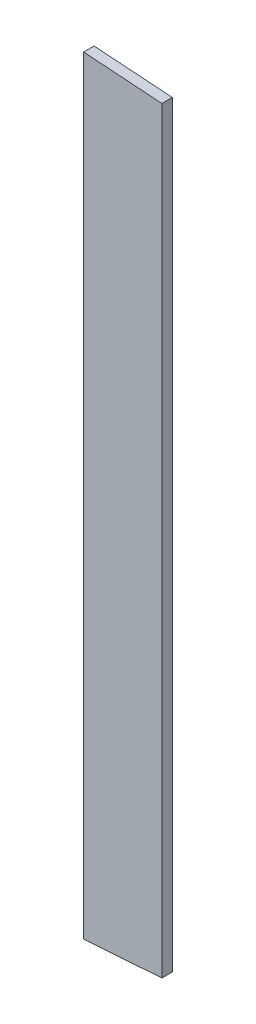
ISO-10303-21;
HEADER;
FILE_DESCRIPTION(('STEP AP214'),'2;1');
FILE_NAME('part.step','',(''),(''),'','','');
FILE_SCHEMA(('AUTOMOTIVE_DESIGN { 1 0 10303 214 1 1 1 1 }'));
ENDSEC;
DATA;
#1=APPLICATION_CONTEXT('core data for automotive mechanical design processes');
#2=APPLICATION_PROTOCOL_DEFINITION('international standard','automotive_design',2000,#1);
#3=PRODUCT_CONTEXT('',#1,'mechanical');
#4=PRODUCT('Part','Part','',(#3));
#5=PRODUCT_RELATED_PRODUCT_CATEGORY('part','',(#4));
#6=PRODUCT_DEFINITION_FORMATION('','',#4);
#7=PRODUCT_DEFINITION_CONTEXT('part definition',#1,'design');
#8=PRODUCT_DEFINITION('design','',#6,#7);
#9=PRODUCT_DEFINITION_SHAPE('','',#8);
#10=(LENGTH_UNIT() NAMED_UNIT(*) SI_UNIT(.MILLI.,.METRE.));
#11=(NAMED_UNIT(*) PLANE_ANGLE_UNIT() SI_UNIT($,.RADIAN.));
#12=(NAMED_UNIT(*) SI_UNIT($,.STERADIAN.) SOLID_ANGLE_UNIT());
#13=UNCERTAINTY_MEASURE_WITH_UNIT(LENGTH_MEASURE(1.E-05),#10,'distance_accuracy_value','');
#14=(GEOMETRIC_REPRESENTATION_CONTEXT(3) GLOBAL_UNCERTAINTY_ASSIGNED_CONTEXT((#13)) GLOBAL_UNIT_ASSIGNED_CONTEXT((#10,
#11,#12)) REPRESENTATION_CONTEXT('',''));
#15=CARTESIAN_POINT('',(0.,0.,0.));
#16=DIRECTION('',(0.,0.,1.));
#17=DIRECTION('',(1.,0.,0.));
#18=AXIS2_PLACEMENT_3D('',#15,#16,#17);
#19=CARTESIAN_POINT('',(-49.7696785158141,491.366899653715,2760.5499999992));
#20=DIRECTION('',(-1.,0.,0.));
#21=DIRECTION('',(0.,-1.,0.));
#22=AXIS2_PLACEMENT_3D('',#19,#20,#21);
#23=PLANE('',#22);
#24=DIRECTION('',(0.,1.,0.));
#25=VECTOR('',#24,1.);
#26=CARTESIAN_POINT('',(-49.7696785158141,491.366899653715,2758.5499999992));
#27=LINE('',#26,#25);
#28=CARTESIAN_POINT('',(-49.7696785158141,346.108282384026,2758.5499999992));
#29=VERTEX_POINT('',#28);
#30=CARTESIAN_POINT('',(-49.7696785158141,491.366899653715,2758.5499999992));
#31=VERTEX_POINT('',#30);
#32=EDGE_CURVE('E96',#29,#31,#27,.T.);
#33=ORIENTED_EDGE('',*,*,#32,.T.);
#34=DIRECTION('',(0.,0.,-1.));
#35=VECTOR('',#34,1.);
#36=CARTESIAN_POINT('',(-49.7696785158141,491.366899653715,2760.5499999992));
#37=LINE('',#36,#35);
#38=CARTESIAN_POINT('',(-49.7696785158141,491.366899653715,2760.5499999992));
#39=VERTEX_POINT('',#38);
#40=EDGE_CURVE('E11',#39,#31,#37,.T.);
#41=ORIENTED_EDGE('',*,*,#40,.F.);
#42=DIRECTION('',(0.,1.,0.));
#43=VECTOR('',#42,1.);
#44=CARTESIAN_POINT('',(-49.7696785158141,491.366899653715,2760.5499999992));
#45=LINE('',#44,#43);
#46=CARTESIAN_POINT('',(-49.7696785158141,346.108282384026,2760.5499999992));
#47=VERTEX_POINT('',#46);
#48=EDGE_CURVE('E84',#47,#39,#45,.T.);
#49=ORIENTED_EDGE('',*,*,#48,.F.);
#50=DIRECTION('',(0.,0.,-1.));
#51=VECTOR('',#50,1.);
#52=CARTESIAN_POINT('',(-49.7696785158141,346.108282384026,2760.5499999992));
#53=LINE('',#52,#51);
#54=EDGE_CURVE('E92',#47,#29,#53,.T.);
#55=ORIENTED_EDGE('',*,*,#54,.T.);
#56=EDGE_LOOP('',(#33,#41,#49,#55));
#57=FACE_BOUND('',#56,.T.);
#58=ADVANCED_FACE('F33',(#57),#23,.F.);
#59=CARTESIAN_POINT('',(-64.7696785158141,492.415801832868,2760.5499999992));
#60=DIRECTION('',(-0.0697564737441179,-0.997564050259825,0.));
#61=DIRECTION('',(0.997564050259825,-0.0697564737441179,0.));
#62=AXIS2_PLACEMENT_3D('',#59,#60,#61);
#63=PLANE('',#62);
#64=DIRECTION('',(-0.997564050259825,0.0697564737441179,0.));
#65=VECTOR('',#64,1.);
#66=CARTESIAN_POINT('',(-64.7696785158141,492.415801832868,2758.5499999992));
#67=LINE('',#66,#65);
#68=CARTESIAN_POINT('',(-64.7696785158141,492.415801832868,2758.5499999992));
#69=VERTEX_POINT('',#68);
#70=EDGE_CURVE('E88',#31,#69,#67,.T.);
#71=ORIENTED_EDGE('',*,*,#70,.T.);
#72=DIRECTION('',(0.,0.,-1.));
#73=VECTOR('',#72,1.);
#74=CARTESIAN_POINT('',(-64.7696785158141,492.415801832868,2760.5499999992));
#75=LINE('',#74,#73);
#76=CARTESIAN_POINT('',(-64.7696785158141,492.415801832868,2760.5499999992));
#77=VERTEX_POINT('',#76);
#78=EDGE_CURVE('E41',#77,#69,#75,.T.);
#79=ORIENTED_EDGE('',*,*,#78,.F.);
#80=DIRECTION('',(-0.997564050259825,0.0697564737441179,0.));
#81=VECTOR('',#80,1.);
#82=CARTESIAN_POINT('',(-64.7696785158141,492.415801832868,2760.5499999992));
#83=LINE('',#82,#81);
#84=EDGE_CURVE('E79',#39,#77,#83,.T.);
#85=ORIENTED_EDGE('',*,*,#84,.F.);
#86=ORIENTED_EDGE('',*,*,#40,.T.);
#87=EDGE_LOOP('',(#71,#79,#85,#86));
#88=FACE_BOUND('',#87,.T.);
#89=ADVANCED_FACE('F87',(#88),#63,.F.);
#90=CARTESIAN_POINT('',(-64.7696785158141,345.059380204873,2760.5499999992));
#91=DIRECTION('',(1.,0.,0.));
#92=DIRECTION('',(0.,0.,-1.));
#93=AXIS2_PLACEMENT_3D('',#90,#91,#92);
#94=PLANE('',#93);
#95=DIRECTION('',(0.,-1.,0.));
#96=VECTOR('',#95,1.);
#97=CARTESIAN_POINT('',(-64.7696785158141,345.059380204873,2758.5499999992));
#98=LINE('',#97,#96);
#99=CARTESIAN_POINT('',(-64.7696785158141,345.059380204873,2758.5499999992));
#100=VERTEX_POINT('',#99);
#101=EDGE_CURVE('E66',#69,#100,#98,.T.);
#102=ORIENTED_EDGE('',*,*,#101,.T.);
#103=DIRECTION('',(0.,0.,-1.));
#104=VECTOR('',#103,1.);
#105=CARTESIAN_POINT('',(-64.7696785158141,345.059380204873,2760.5499999992));
#106=LINE('',#105,#104);
#107=CARTESIAN_POINT('',(-64.7696785158141,345.059380204873,2760.5499999992));
#108=VERTEX_POINT('',#107);
#109=EDGE_CURVE('E89',#108,#100,#106,.T.);
#110=ORIENTED_EDGE('',*,*,#109,.F.);
#111=DIRECTION('',(0.,-1.,0.));
#112=VECTOR('',#111,1.);
#113=CARTESIAN_POINT('',(-64.7696785158141,345.059380204873,2760.5499999992));
#114=LINE('',#113,#112);
#115=EDGE_CURVE('E82',#77,#108,#114,.T.);
#116=ORIENTED_EDGE('',*,*,#115,.F.);
#117=ORIENTED_EDGE('',*,*,#78,.T.);
#118=EDGE_LOOP('',(#102,#110,#116,#117));
#119=FACE_BOUND('',#118,.T.);
#120=ADVANCED_FACE('F90',(#119),#94,.F.);
#121=CARTESIAN_POINT('',(-49.7696785158141,346.108282384026,2760.5499999992));
#122=DIRECTION('',(-0.0697564737441178,0.997564050259825,0.));
#123=DIRECTION('',(-0.997564050259825,-0.0697564737441178,0.));
#124=AXIS2_PLACEMENT_3D('',#121,#122,#123);
#125=PLANE('',#124);
#126=DIRECTION('',(0.997564050259825,0.0697564737441178,0.));
#127=VECTOR('',#126,1.);
#128=CARTESIAN_POINT('',(-49.7696785158141,346.108282384026,2758.5499999992));
#129=LINE('',#128,#127);
#130=EDGE_CURVE('E72',#100,#29,#129,.T.);
#131=ORIENTED_EDGE('',*,*,#130,.T.);
#132=ORIENTED_EDGE('',*,*,#54,.F.);
#133=DIRECTION('',(0.997564050259825,0.0697564737441178,0.));
#134=VECTOR('',#133,1.);
#135=CARTESIAN_POINT('',(-49.7696785158141,346.108282384026,2760.5499999992));
#136=LINE('',#135,#134);
#137=EDGE_CURVE('E49',#108,#47,#136,.T.);
#138=ORIENTED_EDGE('',*,*,#137,.F.);
#139=ORIENTED_EDGE('',*,*,#109,.T.);
#140=EDGE_LOOP('',(#131,#132,#138,#139));
#141=FACE_BOUND('',#140,.T.);
#142=ADVANCED_FACE('F103',(#141),#125,.F.);
#143=CARTESIAN_POINT('',(0.,0.,2760.5499999992));
#144=DIRECTION('',(0.,0.,-1.));
#145=DIRECTION('',(-1.,0.,0.));
#146=AXIS2_PLACEMENT_3D('',#143,#144,#145);
#147=PLANE('',#146);
#148=ORIENTED_EDGE('',*,*,#48,.T.);
#149=ORIENTED_EDGE('',*,*,#84,.T.);
#150=ORIENTED_EDGE('',*,*,#115,.T.);
#151=ORIENTED_EDGE('',*,*,#137,.T.);
#152=EDGE_LOOP('',(#148,#149,#150,#151));
#153=FACE_BOUND('',#152,.T.);
#154=ADVANCED_FACE('F80',(#153),#147,.F.);
#155=CARTESIAN_POINT('',(0.,0.,2758.5499999992));
#156=DIRECTION('',(0.,0.,-1.));
#157=DIRECTION('',(-1.,0.,0.));
#158=AXIS2_PLACEMENT_3D('',#155,#156,#157);
#159=PLANE('',#158);
#160=ORIENTED_EDGE('',*,*,#32,.F.);
#161=ORIENTED_EDGE('',*,*,#130,.F.);
#162=ORIENTED_EDGE('',*,*,#101,.F.);
#163=ORIENTED_EDGE('',*,*,#70,.F.);
#164=EDGE_LOOP('',(#160,#161,#162,#163));
#165=FACE_BOUND('',#164,.T.);
#166=ADVANCED_FACE('F106',(#165),#159,.T.);
#167=CLOSED_SHELL('',(#58,#89,#120,#142,#154,#166));
#168=MANIFOLD_SOLID_BREP('B2',#167);
#169=ADVANCED_BREP_SHAPE_REPRESENTATION('',(#18,#168),#14);
#170=SHAPE_DEFINITION_REPRESENTATION(#9,#169);
ENDSEC;
END-ISO-10303-21;
